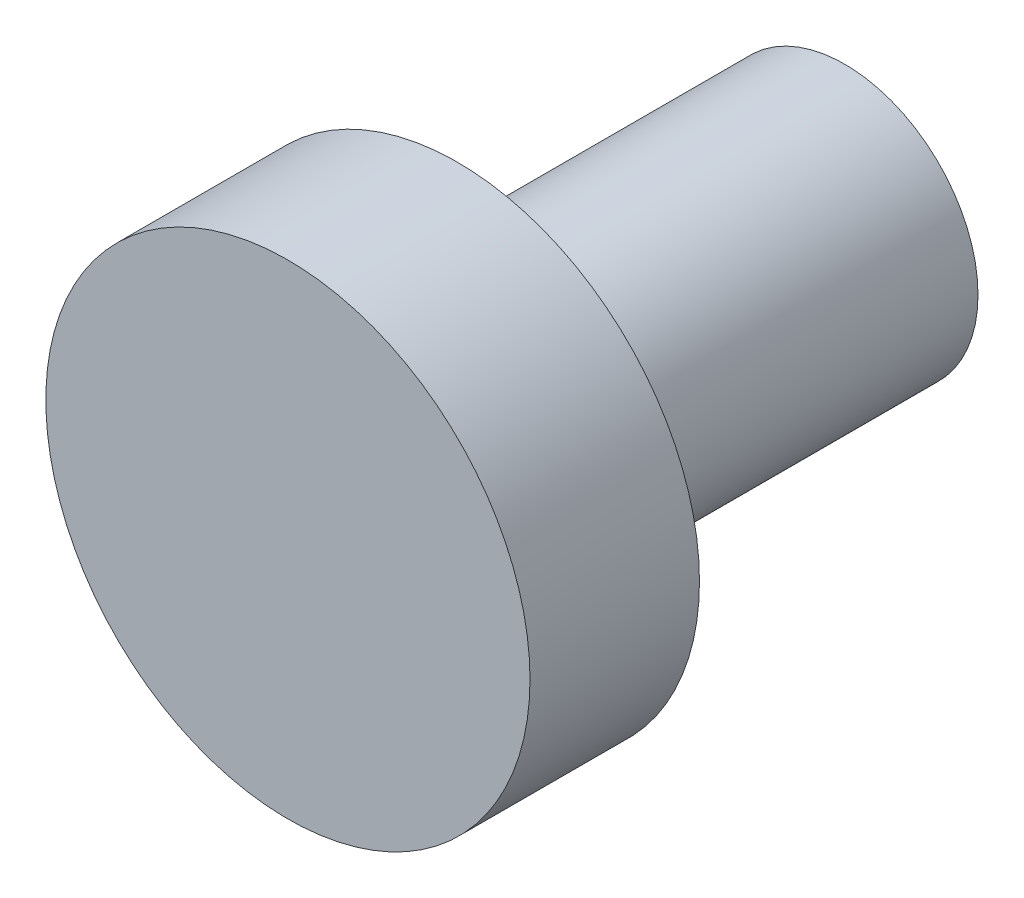
ISO-10303-21;
HEADER;
FILE_DESCRIPTION(('STEP AP214'),'2;1');
FILE_NAME('part.step','',(''),(''),'','','');
FILE_SCHEMA(('AUTOMOTIVE_DESIGN { 1 0 10303 214 1 1 1 1 }'));
ENDSEC;
DATA;
#1=APPLICATION_CONTEXT('core data for automotive mechanical design processes');
#2=APPLICATION_PROTOCOL_DEFINITION('international standard','automotive_design',2000,#1);
#3=PRODUCT_CONTEXT('',#1,'mechanical');
#4=PRODUCT('Part','Part','',(#3));
#5=PRODUCT_RELATED_PRODUCT_CATEGORY('part','',(#4));
#6=PRODUCT_DEFINITION_FORMATION('','',#4);
#7=PRODUCT_DEFINITION_CONTEXT('part definition',#1,'design');
#8=PRODUCT_DEFINITION('design','',#6,#7);
#9=PRODUCT_DEFINITION_SHAPE('','',#8);
#10=(LENGTH_UNIT() NAMED_UNIT(*) SI_UNIT(.MILLI.,.METRE.));
#11=(NAMED_UNIT(*) PLANE_ANGLE_UNIT() SI_UNIT($,.RADIAN.));
#12=(NAMED_UNIT(*) SI_UNIT($,.STERADIAN.) SOLID_ANGLE_UNIT());
#13=UNCERTAINTY_MEASURE_WITH_UNIT(LENGTH_MEASURE(1.E-05),#10,'distance_accuracy_value','');
#14=(GEOMETRIC_REPRESENTATION_CONTEXT(3) GLOBAL_UNCERTAINTY_ASSIGNED_CONTEXT((#13)) GLOBAL_UNIT_ASSIGNED_CONTEXT((#10,
#11,#12)) REPRESENTATION_CONTEXT('',''));
#15=CARTESIAN_POINT('',(0.,0.,0.));
#16=DIRECTION('',(0.,0.,1.));
#17=DIRECTION('',(1.,0.,0.));
#18=AXIS2_PLACEMENT_3D('',#15,#16,#17);
#19=CARTESIAN_POINT('',(-183.,76.,281.5));
#20=DIRECTION('',(0.,0.,1.));
#21=DIRECTION('',(1.,0.,0.));
#22=AXIS2_PLACEMENT_3D('',#19,#20,#21);
#23=PLANE('',#22);
#24=CARTESIAN_POINT('',(-183.,76.,281.5));
#25=DIRECTION('',(0.,0.,1.));
#26=DIRECTION('',(1.,0.,0.));
#27=AXIS2_PLACEMENT_3D('',#24,#25,#26);
#28=CIRCLE('',#27,20.);
#29=CARTESIAN_POINT('',(-163.,76.,281.5));
#30=VERTEX_POINT('',#29);
#31=EDGE_CURVE('P0_E11',#30,#30,#28,.T.);
#32=ORIENTED_EDGE('',*,*,#31,.F.);
#33=EDGE_LOOP('',(#32));
#34=FACE_BOUND('',#33,.T.);
#35=ADVANCED_FACE('P0_F16',(#34),#23,.F.);
#36=CARTESIAN_POINT('',(-183.,76.,295.5));
#37=DIRECTION('',(0.,0.,1.));
#38=DIRECTION('',(1.,0.,0.));
#39=AXIS2_PLACEMENT_3D('',#36,#37,#38);
#40=PLANE('',#39);
#41=CARTESIAN_POINT('',(-183.,76.,295.5));
#42=DIRECTION('',(0.,0.,1.));
#43=DIRECTION('',(1.,0.,0.));
#44=AXIS2_PLACEMENT_3D('',#41,#42,#43);
#45=CIRCLE('',#44,20.);
#46=CARTESIAN_POINT('',(-163.,76.,295.5));
#47=VERTEX_POINT('',#46);
#48=EDGE_CURVE('P0_E20',#47,#47,#45,.T.);
#49=ORIENTED_EDGE('',*,*,#48,.T.);
#50=EDGE_LOOP('',(#49));
#51=FACE_BOUND('',#50,.T.);
#52=ADVANCED_FACE('P0_F44',(#51),#40,.T.);
#53=CARTESIAN_POINT('',(-183.,76.,281.5));
#54=DIRECTION('',(0.,0.,1.));
#55=DIRECTION('',(1.,0.,0.));
#56=AXIS2_PLACEMENT_3D('',#53,#54,#55);
#57=CYLINDRICAL_SURFACE('',#56,20.);
#58=ORIENTED_EDGE('',*,*,#48,.F.);
#59=DIRECTION('',(0.,0.,1.));
#60=VECTOR('',#59,1.);
#61=CARTESIAN_POINT('',(-163.,76.,281.5));
#62=LINE('',#61,#60);
#63=EDGE_CURVE('P0_E26',#30,#47,#62,.T.);
#64=ORIENTED_EDGE('',*,*,#63,.F.);
#65=ORIENTED_EDGE('',*,*,#31,.T.);
#66=ORIENTED_EDGE('',*,*,#63,.T.);
#67=EDGE_LOOP('',(#58,#64,#65,#66));
#68=FACE_BOUND('',#67,.T.);
#69=ADVANCED_FACE('P0_F18',(#68),#57,.T.);
#70=CLOSED_SHELL('',(#35,#52,#69));
#71=MANIFOLD_SOLID_BREP('P0_B1',#70);
#72=CARTESIAN_POINT('',(-183.,76.,249.49));
#73=DIRECTION('',(0.,0.,1.));
#74=DIRECTION('',(1.,0.,0.));
#75=AXIS2_PLACEMENT_3D('',#72,#73,#74);
#76=PLANE('',#75);
#77=CARTESIAN_POINT('',(-183.,76.,249.49));
#78=DIRECTION('',(0.,0.,1.));
#79=DIRECTION('',(1.,0.,0.));
#80=AXIS2_PLACEMENT_3D('',#77,#78,#79);
#81=CIRCLE('',#80,11.);
#82=CARTESIAN_POINT('',(-172.,76.,249.49));
#83=VERTEX_POINT('',#82);
#84=EDGE_CURVE('P1_E10',#83,#83,#81,.T.);
#85=ORIENTED_EDGE('',*,*,#84,.F.);
#86=EDGE_LOOP('',(#85));
#87=FACE_BOUND('',#86,.T.);
#88=ADVANCED_FACE('P1_F15',(#87),#76,.F.);
#89=CARTESIAN_POINT('',(-183.,76.,281.49));
#90=DIRECTION('',(0.,0.,1.));
#91=DIRECTION('',(1.,0.,0.));
#92=AXIS2_PLACEMENT_3D('',#89,#90,#91);
#93=PLANE('',#92);
#94=CARTESIAN_POINT('',(-183.,76.,281.49));
#95=DIRECTION('',(0.,0.,1.));
#96=DIRECTION('',(1.,0.,0.));
#97=AXIS2_PLACEMENT_3D('',#94,#95,#96);
#98=CIRCLE('',#97,11.);
#99=CARTESIAN_POINT('',(-172.,76.,281.49));
#100=VERTEX_POINT('',#99);
#101=EDGE_CURVE('P1_E41',#100,#100,#98,.T.);
#102=ORIENTED_EDGE('',*,*,#101,.T.);
#103=EDGE_LOOP('',(#102));
#104=FACE_BOUND('',#103,.T.);
#105=ADVANCED_FACE('P1_F17',(#104),#93,.T.);
#106=CARTESIAN_POINT('',(-183.,76.,249.49));
#107=DIRECTION('',(0.,0.,1.));
#108=DIRECTION('',(1.,0.,0.));
#109=AXIS2_PLACEMENT_3D('',#106,#107,#108);
#110=CYLINDRICAL_SURFACE('',#109,11.);
#111=ORIENTED_EDGE('',*,*,#101,.F.);
#112=DIRECTION('',(0.,0.,1.));
#113=VECTOR('',#112,1.);
#114=CARTESIAN_POINT('',(-172.,76.,249.49));
#115=LINE('',#114,#113);
#116=EDGE_CURVE('P1_E19',#83,#100,#115,.T.);
#117=ORIENTED_EDGE('',*,*,#116,.F.);
#118=ORIENTED_EDGE('',*,*,#84,.T.);
#119=ORIENTED_EDGE('',*,*,#116,.T.);
#120=EDGE_LOOP('',(#111,#117,#118,#119));
#121=FACE_BOUND('',#120,.T.);
#122=ADVANCED_FACE('P1_F40',(#121),#110,.T.);
#123=CLOSED_SHELL('',(#88,#105,#122));
#124=MANIFOLD_SOLID_BREP('P1_B1',#123);
#125=ADVANCED_BREP_SHAPE_REPRESENTATION('',(#18,#71,#124),#14);
#126=SHAPE_DEFINITION_REPRESENTATION(#9,#125);
ENDSEC;
END-ISO-10303-21;
